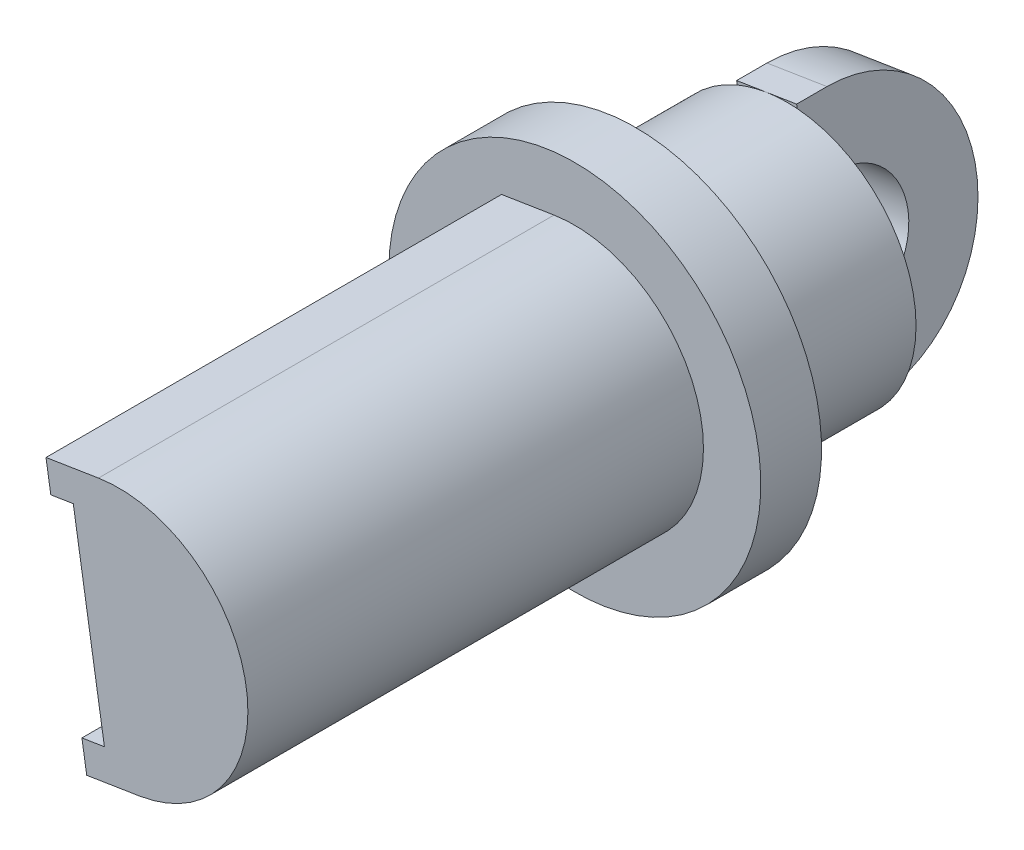
ISO-10303-21;
HEADER;
FILE_DESCRIPTION(('STEP AP214'),'2;1');
FILE_NAME('part.step','',(''),(''),'','','');
FILE_SCHEMA(('AUTOMOTIVE_DESIGN { 1 0 10303 214 1 1 1 1 }'));
ENDSEC;
DATA;
#1=APPLICATION_CONTEXT('core data for automotive mechanical design processes');
#2=APPLICATION_PROTOCOL_DEFINITION('international standard','automotive_design',2000,#1);
#3=PRODUCT_CONTEXT('',#1,'mechanical');
#4=PRODUCT('Part','Part','',(#3));
#5=PRODUCT_RELATED_PRODUCT_CATEGORY('part','',(#4));
#6=PRODUCT_DEFINITION_FORMATION('','',#4);
#7=PRODUCT_DEFINITION_CONTEXT('part definition',#1,'design');
#8=PRODUCT_DEFINITION('design','',#6,#7);
#9=PRODUCT_DEFINITION_SHAPE('','',#8);
#10=(LENGTH_UNIT() NAMED_UNIT(*) SI_UNIT(.MILLI.,.METRE.));
#11=(NAMED_UNIT(*) PLANE_ANGLE_UNIT() SI_UNIT($,.RADIAN.));
#12=(NAMED_UNIT(*) SI_UNIT($,.STERADIAN.) SOLID_ANGLE_UNIT());
#13=UNCERTAINTY_MEASURE_WITH_UNIT(LENGTH_MEASURE(1.E-05),#10,'distance_accuracy_value','');
#14=(GEOMETRIC_REPRESENTATION_CONTEXT(3) GLOBAL_UNCERTAINTY_ASSIGNED_CONTEXT((#13)) GLOBAL_UNIT_ASSIGNED_CONTEXT((#10,
#11,#12)) REPRESENTATION_CONTEXT('',''));
#15=CARTESIAN_POINT('',(0.,0.,0.));
#16=DIRECTION('',(0.,0.,1.));
#17=DIRECTION('',(1.,0.,0.));
#18=AXIS2_PLACEMENT_3D('',#15,#16,#17);
#19=CARTESIAN_POINT('',(-35.5668829363061,-57.3685454593075,0.));
#20=DIRECTION('',(0.,0.,1.));
#21=DIRECTION('',(1.,0.,0.));
#22=AXIS2_PLACEMENT_3D('',#19,#20,#21);
#23=PLANE('',#22);
#24=CARTESIAN_POINT('',(-37.2246621933937,-53.3294529950564,0.));
#25=DIRECTION('',(0.,0.,-1.));
#26=DIRECTION('',(1.,0.,0.));
#27=AXIS2_PLACEMENT_3D('',#24,#25,#26);
#28=CIRCLE('',#27,4.25);
#29=CARTESIAN_POINT('',(-36.5543673811667,-57.5262618857138,0.));
#30=VERTEX_POINT('',#29);
#31=CARTESIAN_POINT('',(-37.5606708795801,-57.5661496047757,0.));
#32=VERTEX_POINT('',#31);
#33=EDGE_CURVE('E211',#30,#32,#28,.T.);
#34=ORIENTED_EDGE('',*,*,#33,.T.);
#35=DIRECTION('',(-0.157716426406365,0.987484444860579,0.));
#36=VECTOR('',#35,1.);
#37=CARTESIAN_POINT('',(-37.5418518260273,-57.6839783121202,0.));
#38=LINE('',#37,#36);
#39=CARTESIAN_POINT('',(-37.5418518260273,-57.6839783121202,0.));
#40=VERTEX_POINT('',#39);
#41=EDGE_CURVE('E254',#40,#32,#38,.T.);
#42=ORIENTED_EDGE('',*,*,#41,.F.);
#43=DIRECTION('',(-0.987484444860579,-0.157716426406364,0.));
#44=VECTOR('',#43,1.);
#45=CARTESIAN_POINT('',(-35.5668829363061,-57.3685454593075,0.));
#46=LINE('',#45,#44);
#47=EDGE_CURVE('E249',#30,#40,#46,.T.);
#48=ORIENTED_EDGE('',*,*,#47,.F.);
#49=EDGE_LOOP('',(#34,#42,#48));
#50=FACE_BOUND('',#49,.T.);
#51=ADVANCED_FACE('F45',(#50),#23,.T.);
#52=CARTESIAN_POINT('',(-37.8949570056207,-49.1326441043989,0.));
#53=VERTEX_POINT('',#52);
#54=CARTESIAN_POINT('',(-36.8886535072073,-49.0927563853371,0.));
#55=VERTEX_POINT('',#54);
#56=EDGE_CURVE('E396',#53,#55,#28,.T.);
#57=ORIENTED_EDGE('',*,*,#56,.T.);
#58=DIRECTION('',(-0.157716426406365,0.987484444860579,0.));
#59=VECTOR('',#58,1.);
#60=CARTESIAN_POINT('',(-35.5668829363061,-57.3685454593075,0.));
#61=LINE('',#60,#59);
#62=CARTESIAN_POINT('',(-36.9074725607602,-48.9749276779926,0.));
#63=VERTEX_POINT('',#62);
#64=EDGE_CURVE('E234',#55,#63,#61,.T.);
#65=ORIENTED_EDGE('',*,*,#64,.T.);
#66=DIRECTION('',(-0.987484444860579,-0.157716426406364,0.));
#67=VECTOR('',#66,1.);
#68=CARTESIAN_POINT('',(-36.9074725607602,-48.9749276779926,0.));
#69=LINE('',#68,#67);
#70=EDGE_CURVE('E272',#63,#53,#69,.T.);
#71=ORIENTED_EDGE('',*,*,#70,.T.);
#72=EDGE_LOOP('',(#57,#65,#71));
#73=FACE_BOUND('',#72,.T.);
#74=ADVANCED_FACE('F341',(#73),#23,.T.);
#75=CARTESIAN_POINT('',(-35.5857019898589,-57.250716751963,0.));
#76=VERTEX_POINT('',#75);
#77=EDGE_CURVE('E206',#76,#30,#28,.T.);
#78=ORIENTED_EDGE('',*,*,#77,.T.);
#79=CARTESIAN_POINT('',(-35.5668829363061,-57.3685454593075,0.));
#80=VERTEX_POINT('',#79);
#81=EDGE_CURVE('E277',#80,#30,#46,.T.);
#82=ORIENTED_EDGE('',*,*,#81,.F.);
#83=EDGE_CURVE('E236',#80,#76,#61,.T.);
#84=ORIENTED_EDGE('',*,*,#83,.T.);
#85=EDGE_LOOP('',(#78,#82,#84));
#86=FACE_BOUND('',#85,.T.);
#87=ADVANCED_FACE('F348',(#86),#23,.T.);
#88=CARTESIAN_POINT('',(-35.5668829363061,-57.3685454593075,-1.));
#89=DIRECTION('',(0.157716426406364,-0.987484444860579,0.));
#90=DIRECTION('',(0.987484444860579,0.157716426406364,0.));
#91=AXIS2_PLACEMENT_3D('',#88,#89,#90);
#92=PLANE('',#91);
#93=DIRECTION('',(0.,0.,1.));
#94=VECTOR('',#93,1.);
#95=CARTESIAN_POINT('',(-37.5418518260273,-57.6839783121202,-1.));
#96=LINE('',#95,#94);
#97=CARTESIAN_POINT('',(-37.5418518260273,-57.6839783121202,-1.));
#98=VERTEX_POINT('',#97);
#99=EDGE_CURVE('E229',#98,#40,#96,.T.);
#100=ORIENTED_EDGE('',*,*,#99,.F.);
#101=DIRECTION('',(-0.987484444860579,-0.157716426406364,0.));
#102=VECTOR('',#101,1.);
#103=CARTESIAN_POINT('',(-35.5668829363061,-57.3685454593074,-1.));
#104=LINE('',#103,#102);
#105=CARTESIAN_POINT('',(-35.5668829363061,-57.3685454593074,-1.));
#106=VERTEX_POINT('',#105);
#107=EDGE_CURVE('E265',#106,#98,#104,.T.);
#108=ORIENTED_EDGE('',*,*,#107,.F.);
#109=DIRECTION('',(0.,0.,1.));
#110=VECTOR('',#109,1.);
#111=CARTESIAN_POINT('',(-35.5668829363061,-57.3685454593075,-1.));
#112=LINE('',#111,#110);
#113=EDGE_CURVE('E230',#106,#80,#112,.T.);
#114=ORIENTED_EDGE('',*,*,#113,.T.);
#115=ORIENTED_EDGE('',*,*,#81,.T.);
#116=ORIENTED_EDGE('',*,*,#47,.T.);
#117=EDGE_LOOP('',(#100,#108,#114,#115,#116));
#118=FACE_BOUND('',#117,.T.);
#119=ADVANCED_FACE('F47',(#118),#92,.T.);
#120=CARTESIAN_POINT('',(-36.2371777485331,-53.17173656865,-1.));
#121=DIRECTION('',(-0.987484444860579,-0.157716426406364,0.));
#122=DIRECTION('',(0.157716426406364,-0.987484444860579,0.));
#123=AXIS2_PLACEMENT_3D('',#120,#121,#122);
#124=CYLINDRICAL_SURFACE('',#123,4.24999999999999);
#125=CARTESIAN_POINT('',(-38.2121466382543,-53.4871694214627,-1.));
#126=DIRECTION('',(-0.987484444860579,-0.157716426406364,0.));
#127=DIRECTION('',(0.157716426406364,-0.987484444860579,0.));
#128=AXIS2_PLACEMENT_3D('',#125,#126,#127);
#129=CIRCLE('',#128,4.24999999999999);
#130=CARTESIAN_POINT('',(-38.8824414504814,-49.2903605308053,-1.));
#131=VERTEX_POINT('',#130);
#132=EDGE_CURVE('E235',#131,#98,#129,.T.);
#133=ORIENTED_EDGE('',*,*,#132,.F.);
#134=DIRECTION('',(-0.987484444860579,-0.157716426406364,0.));
#135=VECTOR('',#134,1.);
#136=CARTESIAN_POINT('',(-36.9074725607602,-48.9749276779926,-1.));
#137=LINE('',#136,#135);
#138=CARTESIAN_POINT('',(-36.9074725607602,-48.9749276779926,-1.));
#139=VERTEX_POINT('',#138);
#140=EDGE_CURVE('E269',#139,#131,#137,.T.);
#141=ORIENTED_EDGE('',*,*,#140,.F.);
#142=CARTESIAN_POINT('',(-36.2371777485331,-53.17173656865,-1.));
#143=DIRECTION('',(-0.987484444860579,-0.157716426406364,0.));
#144=DIRECTION('',(0.157716426406364,-0.987484444860579,0.));
#145=AXIS2_PLACEMENT_3D('',#142,#143,#144);
#146=CIRCLE('',#145,4.24999999999999);
#147=EDGE_CURVE('E245',#139,#106,#146,.T.);
#148=ORIENTED_EDGE('',*,*,#147,.T.);
#149=ORIENTED_EDGE('',*,*,#107,.T.);
#150=EDGE_LOOP('',(#133,#141,#148,#149));
#151=FACE_BOUND('',#150,.T.);
#152=ADVANCED_FACE('F363',(#151),#124,.T.);
#153=CARTESIAN_POINT('',(-36.9074725607602,-48.9749276779926,0.));
#154=DIRECTION('',(-0.157716426406364,0.987484444860579,0.));
#155=DIRECTION('',(-0.987484444860579,-0.157716426406364,0.));
#156=AXIS2_PLACEMENT_3D('',#153,#154,#155);
#157=PLANE('',#156);
#158=DIRECTION('',(0.,0.,-1.));
#159=VECTOR('',#158,1.);
#160=CARTESIAN_POINT('',(-38.8824414504814,-49.2903605308053,0.));
#161=LINE('',#160,#159);
#162=CARTESIAN_POINT('',(-38.8824414504814,-49.2903605308053,0.));
#163=VERTEX_POINT('',#162);
#164=EDGE_CURVE('E258',#163,#131,#161,.T.);
#165=ORIENTED_EDGE('',*,*,#164,.F.);
#166=EDGE_CURVE('E276',#53,#163,#69,.T.);
#167=ORIENTED_EDGE('',*,*,#166,.F.);
#168=ORIENTED_EDGE('',*,*,#70,.F.);
#169=DIRECTION('',(0.,0.,-1.));
#170=VECTOR('',#169,1.);
#171=CARTESIAN_POINT('',(-36.9074725607602,-48.9749276779926,0.));
#172=LINE('',#171,#170);
#173=EDGE_CURVE('E240',#63,#139,#172,.T.);
#174=ORIENTED_EDGE('',*,*,#173,.T.);
#175=ORIENTED_EDGE('',*,*,#140,.T.);
#176=EDGE_LOOP('',(#165,#167,#168,#174,#175));
#177=FACE_BOUND('',#176,.T.);
#178=ADVANCED_FACE('F354',(#177),#157,.T.);
#179=CARTESIAN_POINT('',(-38.8636223969285,-49.4081892381498,0.));
#180=VERTEX_POINT('',#179);
#181=EDGE_CURVE('E399',#180,#53,#28,.T.);
#182=ORIENTED_EDGE('',*,*,#181,.T.);
#183=ORIENTED_EDGE('',*,*,#166,.T.);
#184=EDGE_CURVE('E253',#180,#163,#38,.T.);
#185=ORIENTED_EDGE('',*,*,#184,.F.);
#186=EDGE_LOOP('',(#182,#183,#185));
#187=FACE_BOUND('',#186,.T.);
#188=ADVANCED_FACE('F343',(#187),#23,.T.);
#189=CARTESIAN_POINT('',(-36.2371777485331,-53.17173656865,-1.));
#190=DIRECTION('',(-0.987484444860579,-0.157716426406364,0.));
#191=DIRECTION('',(0.157716426406364,-0.987484444860579,0.));
#192=AXIS2_PLACEMENT_3D('',#189,#190,#191);
#193=PLANE('',#192);
#194=CARTESIAN_POINT('',(-36.5103506122571,-51.4613633384676,0.));
#195=VERTEX_POINT('',#194);
#196=EDGE_CURVE('E241',#195,#55,#61,.T.);
#197=ORIENTED_EDGE('',*,*,#196,.F.);
#198=CARTESIAN_POINT('',(-36.2371777485331,-53.17173656865,-1.));
#199=DIRECTION('',(0.987484444860579,0.157716426406364,0.));
#200=DIRECTION('',(-0.157716426406364,0.987484444860579,0.));
#201=AXIS2_PLACEMENT_3D('',#198,#199,#200);
#202=CIRCLE('',#201,1.99999999999993);
#203=CARTESIAN_POINT('',(-35.9640048848091,-54.8821097988324,0.));
#204=VERTEX_POINT('',#203);
#205=EDGE_CURVE('E218',#204,#195,#202,.T.);
#206=ORIENTED_EDGE('',*,*,#205,.F.);
#207=DIRECTION('',(-0.157716426406364,0.987484444860579,0.));
#208=VECTOR('',#207,1.);
#209=CARTESIAN_POINT('',(-36.2371777485331,-53.17173656865,0.));
#210=LINE('',#209,#208);
#211=EDGE_CURVE('E215',#76,#204,#210,.T.);
#212=ORIENTED_EDGE('',*,*,#211,.F.);
#213=ORIENTED_EDGE('',*,*,#83,.F.);
#214=ORIENTED_EDGE('',*,*,#113,.F.);
#215=ORIENTED_EDGE('',*,*,#147,.F.);
#216=ORIENTED_EDGE('',*,*,#173,.F.);
#217=ORIENTED_EDGE('',*,*,#64,.F.);
#218=EDGE_LOOP('',(#197,#206,#212,#213,#214,#215,#216,#217));
#219=FACE_BOUND('',#218,.T.);
#220=ADVANCED_FACE('F353',(#219),#193,.F.);
#221=CARTESIAN_POINT('',(-38.2121466382543,-53.4871694214627,-1.));
#222=DIRECTION('',(-0.987484444860579,-0.157716426406364,0.));
#223=DIRECTION('',(0.157716426406364,-0.987484444860579,0.));
#224=AXIS2_PLACEMENT_3D('',#221,#222,#223);
#225=PLANE('',#224);
#226=CARTESIAN_POINT('',(-38.2121466382543,-53.4871694214627,-1.));
#227=DIRECTION('',(-0.987484444860579,-0.157716426406364,0.));
#228=DIRECTION('',(0.157716426406364,-0.987484444860579,0.));
#229=AXIS2_PLACEMENT_3D('',#226,#227,#228);
#230=CIRCLE('',#229,1.99999999999993);
#231=CARTESIAN_POINT('',(-38.4853195019783,-51.7767961912803,0.));
#232=VERTEX_POINT('',#231);
#233=CARTESIAN_POINT('',(-37.9389737745303,-55.1975426516451,0.));
#234=VERTEX_POINT('',#233);
#235=EDGE_CURVE('E268',#232,#234,#230,.T.);
#236=ORIENTED_EDGE('',*,*,#235,.F.);
#237=EDGE_CURVE('E69',#232,#180,#38,.T.);
#238=ORIENTED_EDGE('',*,*,#237,.T.);
#239=ORIENTED_EDGE('',*,*,#184,.T.);
#240=ORIENTED_EDGE('',*,*,#164,.T.);
#241=ORIENTED_EDGE('',*,*,#132,.T.);
#242=ORIENTED_EDGE('',*,*,#99,.T.);
#243=ORIENTED_EDGE('',*,*,#41,.T.);
#244=DIRECTION('',(-0.157716426406364,0.987484444860579,0.));
#245=VECTOR('',#244,1.);
#246=CARTESIAN_POINT('',(-38.2121466382543,-53.4871694214627,0.));
#247=LINE('',#246,#245);
#248=EDGE_CURVE('E210',#32,#234,#247,.T.);
#249=ORIENTED_EDGE('',*,*,#248,.T.);
#250=EDGE_LOOP('',(#236,#238,#239,#240,#241,#242,#243,#249));
#251=FACE_BOUND('',#250,.T.);
#252=ADVANCED_FACE('F360',(#251),#225,.T.);
#253=CARTESIAN_POINT('',(-36.2371777485331,-53.17173656865,-1.));
#254=DIRECTION('',(0.987484444860579,0.157716426406364,0.));
#255=DIRECTION('',(-0.157716426406364,0.987484444860579,0.));
#256=AXIS2_PLACEMENT_3D('',#253,#254,#255);
#257=CYLINDRICAL_SURFACE('',#256,1.99999999999993);
#258=DIRECTION('',(0.987484444860579,0.157716426406364,0.));
#259=VECTOR('',#258,1.);
#260=CARTESIAN_POINT('',(-35.9640048848091,-54.8821097988324,0.));
#261=LINE('',#260,#259);
#262=EDGE_CURVE('E225',#234,#204,#261,.T.);
#263=ORIENTED_EDGE('',*,*,#262,.T.);
#264=ORIENTED_EDGE('',*,*,#205,.T.);
#265=DIRECTION('',(0.987484444860579,0.157716426406364,0.));
#266=VECTOR('',#265,1.);
#267=CARTESIAN_POINT('',(-36.5103506122571,-51.4613633384676,0.));
#268=LINE('',#267,#266);
#269=EDGE_CURVE('E222',#195,#232,#268,.F.);
#270=ORIENTED_EDGE('',*,*,#269,.T.);
#271=ORIENTED_EDGE('',*,*,#235,.T.);
#272=EDGE_LOOP('',(#263,#264,#270,#271));
#273=FACE_BOUND('',#272,.T.);
#274=ADVANCED_FACE('F412',(#273),#257,.F.);
#275=CARTESIAN_POINT('',(-37.2246621933937,-53.3294529950564,0.));
#276=DIRECTION('',(0.,0.,1.));
#277=DIRECTION('',(1.,0.,0.));
#278=AXIS2_PLACEMENT_3D('',#275,#276,#277);
#279=PLANE('',#278);
#280=EDGE_CURVE('E200',#55,#76,#28,.T.);
#281=ORIENTED_EDGE('',*,*,#280,.T.);
#282=ORIENTED_EDGE('',*,*,#211,.T.);
#283=ORIENTED_EDGE('',*,*,#262,.F.);
#284=ORIENTED_EDGE('',*,*,#248,.F.);
#285=EDGE_CURVE('E401',#32,#180,#28,.T.);
#286=ORIENTED_EDGE('',*,*,#285,.T.);
#287=ORIENTED_EDGE('',*,*,#237,.F.);
#288=ORIENTED_EDGE('',*,*,#269,.F.);
#289=ORIENTED_EDGE('',*,*,#196,.T.);
#290=EDGE_LOOP('',(#281,#282,#283,#284,#286,#287,#288,#289));
#291=FACE_BOUND('',#290,.T.);
#292=ADVANCED_FACE('F395',(#291),#279,.F.);
#293=CARTESIAN_POINT('',(-37.2246621933937,-53.3294529950564,7.));
#294=DIRECTION('',(0.,0.,-1.));
#295=DIRECTION('',(-1.,0.,0.));
#296=AXIS2_PLACEMENT_3D('',#293,#294,#295);
#297=CYLINDRICAL_SURFACE('',#296,4.25);
#298=CARTESIAN_POINT('',(-37.2246621933937,-53.3294529950564,5.));
#299=DIRECTION('',(0.,0.,-1.));
#300=DIRECTION('',(-1.,0.,0.));
#301=AXIS2_PLACEMENT_3D('',#298,#299,#300);
#302=CIRCLE('',#301,4.25);
#303=CARTESIAN_POINT('',(-41.4746621933937,-53.3294529950564,5.));
#304=VERTEX_POINT('',#303);
#305=EDGE_CURVE('E11',#304,#304,#302,.F.);
#306=ORIENTED_EDGE('',*,*,#305,.F.);
#307=EDGE_LOOP('',(#306));
#308=FACE_BOUND('',#307,.T.);
#309=ORIENTED_EDGE('',*,*,#77,.F.);
#310=ORIENTED_EDGE('',*,*,#280,.F.);
#311=ORIENTED_EDGE('',*,*,#56,.F.);
#312=ORIENTED_EDGE('',*,*,#181,.F.);
#313=ORIENTED_EDGE('',*,*,#285,.F.);
#314=ORIENTED_EDGE('',*,*,#33,.F.);
#315=EDGE_LOOP('',(#309,#310,#311,#312,#313,#314));
#316=FACE_BOUND('',#315,.T.);
#317=ADVANCED_FACE('F335',(#308,#316),#297,.T.);
#318=CARTESIAN_POINT('',(-37.2109521695139,-53.4152933582224,5.));
#319=DIRECTION('',(0.,0.,1.));
#320=DIRECTION('',(1.,0.,0.));
#321=AXIS2_PLACEMENT_3D('',#318,#319,#320);
#322=CYLINDRICAL_SURFACE('',#321,6.12499999999999);
#323=CARTESIAN_POINT('',(-37.2109521695139,-53.4152933582224,5.));
#324=DIRECTION('',(0.,0.,-1.));
#325=DIRECTION('',(-1.,0.,0.));
#326=AXIS2_PLACEMENT_3D('',#323,#324,#325);
#327=CIRCLE('',#326,6.12499999999999);
#328=CARTESIAN_POINT('',(-43.3359521695139,-53.4152933582224,5.));
#329=VERTEX_POINT('',#328);
#330=EDGE_CURVE('E179',#329,#329,#327,.T.);
#331=ORIENTED_EDGE('',*,*,#330,.F.);
#332=EDGE_LOOP('',(#331));
#333=FACE_BOUND('',#332,.T.);
#334=CARTESIAN_POINT('',(-37.2109521695139,-53.4152933582224,7.));
#335=DIRECTION('',(0.,0.,-1.));
#336=DIRECTION('',(-1.,0.,0.));
#337=AXIS2_PLACEMENT_3D('',#334,#335,#336);
#338=CIRCLE('',#337,6.12499999999999);
#339=CARTESIAN_POINT('',(-43.3359521695139,-53.4152933582224,7.));
#340=VERTEX_POINT('',#339);
#341=EDGE_CURVE('E596',#340,#340,#338,.T.);
#342=ORIENTED_EDGE('',*,*,#341,.T.);
#343=EDGE_LOOP('',(#342));
#344=FACE_BOUND('',#343,.T.);
#345=ADVANCED_FACE('F485',(#333,#344),#322,.T.);
#346=CARTESIAN_POINT('',(-37.2109521695139,-53.4152933582224,5.));
#347=DIRECTION('',(0.,0.,-1.));
#348=DIRECTION('',(-1.,0.,0.));
#349=AXIS2_PLACEMENT_3D('',#346,#347,#348);
#350=PLANE('',#349);
#351=ORIENTED_EDGE('',*,*,#305,.T.);
#352=EDGE_LOOP('',(#351));
#353=FACE_BOUND('',#352,.T.);
#354=ORIENTED_EDGE('',*,*,#330,.T.);
#355=EDGE_LOOP('',(#354));
#356=FACE_BOUND('',#355,.T.);
#357=ADVANCED_FACE('F535',(#353,#356),#350,.T.);
#358=CARTESIAN_POINT('',(-37.6995682524336,-56.6964938672596,7.));
#359=DIRECTION('',(0.987484444860579,0.157716426406365,0.));
#360=DIRECTION('',(-0.157716426406365,0.987484444860579,0.));
#361=AXIS2_PLACEMENT_3D('',#358,#359,#360);
#362=PLANE('',#361);
#363=DIRECTION('',(-0.157716426406365,0.987484444860579,0.));
#364=VECTOR('',#363,1.);
#365=CARTESIAN_POINT('',(-37.6995682524336,-56.6964938672596,22.));
#366=LINE('',#365,#364);
#367=CARTESIAN_POINT('',(-37.6995682524336,-56.6964938672596,22.));
#368=VERTEX_POINT('',#367);
#369=CARTESIAN_POINT('',(-38.724725024075,-50.2778449756658,22.));
#370=VERTEX_POINT('',#369);
#371=EDGE_CURVE('E61',#368,#370,#366,.T.);
#372=ORIENTED_EDGE('',*,*,#371,.T.);
#373=DIRECTION('',(0.,0.,1.));
#374=VECTOR('',#373,1.);
#375=CARTESIAN_POINT('',(-38.724725024075,-50.2778449756658,7.));
#376=LINE('',#375,#374);
#377=CARTESIAN_POINT('',(-38.724725024075,-50.2778449756658,7.));
#378=VERTEX_POINT('',#377);
#379=EDGE_CURVE('E614',#378,#370,#376,.T.);
#380=ORIENTED_EDGE('',*,*,#379,.F.);
#381=DIRECTION('',(-0.157716426406365,0.987484444860579,0.));
#382=VECTOR('',#381,1.);
#383=CARTESIAN_POINT('',(-37.6995682524336,-56.6964938672596,7.));
#384=LINE('',#383,#382);
#385=CARTESIAN_POINT('',(-37.6995682524336,-56.6964938672596,7.));
#386=VERTEX_POINT('',#385);
#387=EDGE_CURVE('E602',#386,#378,#384,.T.);
#388=ORIENTED_EDGE('',*,*,#387,.F.);
#389=DIRECTION('',(0.,0.,1.));
#390=VECTOR('',#389,1.);
#391=CARTESIAN_POINT('',(-37.6995682524336,-56.6964938672596,7.));
#392=LINE('',#391,#390);
#393=EDGE_CURVE('E303',#386,#368,#392,.T.);
#394=ORIENTED_EDGE('',*,*,#393,.T.);
#395=EDGE_LOOP('',(#372,#380,#388,#394));
#396=FACE_BOUND('',#395,.T.);
#397=ADVANCED_FACE('F516',(#396),#362,.F.);
#398=CARTESIAN_POINT('',(-38.6870526972942,-56.854210293666,7.));
#399=DIRECTION('',(0.157716426406365,-0.987484444860579,0.));
#400=DIRECTION('',(0.987484444860579,0.157716426406365,0.));
#401=AXIS2_PLACEMENT_3D('',#398,#399,#400);
#402=PLANE('',#401);
#403=DIRECTION('',(-0.987484444860579,-0.157716426406365,0.));
#404=VECTOR('',#403,1.);
#405=CARTESIAN_POINT('',(-36.712083807573,-56.5387774408533,22.));
#406=LINE('',#405,#404);
#407=CARTESIAN_POINT('',(-38.440181586079,-56.8147811870644,22.));
#408=VERTEX_POINT('',#407);
#409=EDGE_CURVE('E54',#368,#408,#406,.T.);
#410=ORIENTED_EDGE('',*,*,#409,.F.);
#411=ORIENTED_EDGE('',*,*,#393,.F.);
#412=DIRECTION('',(0.987484444860579,0.157716426406365,0.));
#413=VECTOR('',#412,1.);
#414=CARTESIAN_POINT('',(-38.6870526972942,-56.854210293666,7.));
#415=LINE('',#414,#413);
#416=CARTESIAN_POINT('',(-38.440181586079,-56.8147811870644,7.));
#417=VERTEX_POINT('',#416);
#418=EDGE_CURVE('E611',#417,#386,#415,.T.);
#419=ORIENTED_EDGE('',*,*,#418,.F.);
#420=DIRECTION('',(0.,0.,-1.));
#421=VECTOR('',#420,1.);
#422=CARTESIAN_POINT('',(-38.440181586079,-56.8147811870644,22.));
#423=LINE('',#422,#421);
#424=EDGE_CURVE('E296',#408,#417,#423,.T.);
#425=ORIENTED_EDGE('',*,*,#424,.F.);
#426=EDGE_LOOP('',(#410,#411,#419,#425));
#427=FACE_BOUND('',#426,.T.);
#428=ADVANCED_FACE('F509',(#427),#402,.F.);
#429=CARTESIAN_POINT('',(-38.724725024075,-50.2778449756658,7.));
#430=DIRECTION('',(-0.157716426406371,0.987484444860578,0.));
#431=DIRECTION('',(-0.987484444860578,-0.157716426406371,0.));
#432=AXIS2_PLACEMENT_3D('',#429,#430,#431);
#433=PLANE('',#432);
#434=DIRECTION('',(-0.987484444860578,-0.157716426406371,0.));
#435=VECTOR('',#434,1.);
#436=CARTESIAN_POINT('',(-38.724725024075,-50.2778449756658,7.));
#437=LINE('',#436,#435);
#438=CARTESIAN_POINT('',(-39.4653383577204,-50.3961322954706,7.));
#439=VERTEX_POINT('',#438);
#440=EDGE_CURVE('E606',#378,#439,#437,.T.);
#441=ORIENTED_EDGE('',*,*,#440,.F.);
#442=ORIENTED_EDGE('',*,*,#379,.T.);
#443=DIRECTION('',(-0.987484444860578,-0.157716426406371,0.));
#444=VECTOR('',#443,1.);
#445=CARTESIAN_POINT('',(-38.724725024075,-50.2778449756658,22.));
#446=LINE('',#445,#444);
#447=CARTESIAN_POINT('',(-39.4653383577204,-50.3961322954706,22.));
#448=VERTEX_POINT('',#447);
#449=EDGE_CURVE('E607',#370,#448,#446,.T.);
#450=ORIENTED_EDGE('',*,*,#449,.T.);
#451=DIRECTION('',(0.,0.,1.));
#452=VECTOR('',#451,1.);
#453=CARTESIAN_POINT('',(-39.4653383577204,-50.3961322954706,22.));
#454=LINE('',#453,#452);
#455=EDGE_CURVE('E300',#439,#448,#454,.T.);
#456=ORIENTED_EDGE('',*,*,#455,.F.);
#457=EDGE_LOOP('',(#441,#442,#450,#456));
#458=FACE_BOUND('',#457,.T.);
#459=ADVANCED_FACE('F515',(#458),#433,.F.);
#460=CARTESIAN_POINT('',(-37.2246621933937,-53.3294529950564,22.));
#461=DIRECTION('',(0.,0.,-1.));
#462=DIRECTION('',(-1.,0.,0.));
#463=AXIS2_PLACEMENT_3D('',#460,#461,#462);
#464=PLANE('',#463);
#465=ORIENTED_EDGE('',*,*,#371,.F.);
#466=ORIENTED_EDGE('',*,*,#409,.T.);
#467=DIRECTION('',(0.157716426406358,-0.98748444486058,0.));
#468=VECTOR('',#467,1.);
#469=CARTESIAN_POINT('',(-38.2824651596727,-57.8022656319249,22.));
#470=LINE('',#469,#468);
#471=CARTESIAN_POINT('',(-38.2824651596727,-57.8022656319249,22.));
#472=VERTEX_POINT('',#471);
#473=EDGE_CURVE('E312',#408,#472,#470,.T.);
#474=ORIENTED_EDGE('',*,*,#473,.T.);
#475=DIRECTION('',(0.98748444486058,0.157716426406358,0.));
#476=VECTOR('',#475,1.);
#477=CARTESIAN_POINT('',(-36.5543673811667,-57.5262618857138,22.));
#478=LINE('',#477,#476);
#479=CARTESIAN_POINT('',(-36.5543673811667,-57.5262618857139,22.));
#480=VERTEX_POINT('',#479);
#481=EDGE_CURVE('E311',#472,#480,#478,.T.);
#482=ORIENTED_EDGE('',*,*,#481,.T.);
#483=CARTESIAN_POINT('',(-37.2246621933937,-53.3294529950564,22.));
#484=DIRECTION('',(0.,0.,1.));
#485=DIRECTION('',(-1.,0.,0.));
#486=AXIS2_PLACEMENT_3D('',#483,#484,#485);
#487=CIRCLE('',#486,4.24999999999999);
#488=CARTESIAN_POINT('',(-37.8949570056207,-49.1326441043989,22.));
#489=VERTEX_POINT('',#488);
#490=EDGE_CURVE('E194',#480,#489,#487,.T.);
#491=ORIENTED_EDGE('',*,*,#490,.T.);
#492=DIRECTION('',(-0.98748444486058,-0.157716426406359,0.));
#493=VECTOR('',#492,1.);
#494=CARTESIAN_POINT('',(-39.6230547841267,-49.40864785061,22.));
#495=LINE('',#494,#493);
#496=CARTESIAN_POINT('',(-39.6230547841267,-49.40864785061,22.));
#497=VERTEX_POINT('',#496);
#498=EDGE_CURVE('E316',#489,#497,#495,.T.);
#499=ORIENTED_EDGE('',*,*,#498,.T.);
#500=EDGE_CURVE('E307',#497,#448,#470,.T.);
#501=ORIENTED_EDGE('',*,*,#500,.T.);
#502=ORIENTED_EDGE('',*,*,#449,.F.);
#503=EDGE_LOOP('',(#465,#466,#474,#482,#491,#499,#501,#502));
#504=FACE_BOUND('',#503,.T.);
#505=ADVANCED_FACE('F326',(#504),#464,.F.);
#506=CARTESIAN_POINT('',(-39.6230547841267,-49.40864785061,22.));
#507=DIRECTION('',(0.157716426406359,-0.98748444486058,0.));
#508=DIRECTION('',(0.98748444486058,0.157716426406359,0.));
#509=AXIS2_PLACEMENT_3D('',#506,#507,#508);
#510=PLANE('',#509);
#511=DIRECTION('',(-0.98748444486058,-0.157716426406359,0.));
#512=VECTOR('',#511,1.);
#513=CARTESIAN_POINT('',(-39.6230547841267,-49.40864785061,7.));
#514=LINE('',#513,#512);
#515=CARTESIAN_POINT('',(-37.8949570056207,-49.1326441043989,7.));
#516=VERTEX_POINT('',#515);
#517=CARTESIAN_POINT('',(-39.6230547841267,-49.40864785061,7.));
#518=VERTEX_POINT('',#517);
#519=EDGE_CURVE('E173',#516,#518,#514,.T.);
#520=ORIENTED_EDGE('',*,*,#519,.T.);
#521=DIRECTION('',(0.,0.,-1.));
#522=VECTOR('',#521,1.);
#523=CARTESIAN_POINT('',(-39.6230547841267,-49.40864785061,22.));
#524=LINE('',#523,#522);
#525=EDGE_CURVE('E202',#497,#518,#524,.T.);
#526=ORIENTED_EDGE('',*,*,#525,.F.);
#527=ORIENTED_EDGE('',*,*,#498,.F.);
#528=DIRECTION('',(0.,0.,-1.));
#529=VECTOR('',#528,1.);
#530=CARTESIAN_POINT('',(-37.8949570056207,-49.1326441043989,22.));
#531=LINE('',#530,#529);
#532=EDGE_CURVE('E196',#489,#516,#531,.T.);
#533=ORIENTED_EDGE('',*,*,#532,.T.);
#534=EDGE_LOOP('',(#520,#526,#527,#533));
#535=FACE_BOUND('',#534,.T.);
#536=ADVANCED_FACE('F339',(#535),#510,.F.);
#537=CARTESIAN_POINT('',(-38.2824651596727,-57.8022656319249,22.));
#538=DIRECTION('',(0.98748444486058,0.157716426406358,0.));
#539=DIRECTION('',(-0.157716426406358,0.98748444486058,0.));
#540=AXIS2_PLACEMENT_3D('',#537,#538,#539);
#541=PLANE('',#540);
#542=DIRECTION('',(0.157716426406358,-0.98748444486058,0.));
#543=VECTOR('',#542,1.);
#544=CARTESIAN_POINT('',(-38.2824651596727,-57.8022656319249,7.));
#545=LINE('',#544,#543);
#546=EDGE_CURVE('E283',#518,#439,#545,.T.);
#547=ORIENTED_EDGE('',*,*,#546,.T.);
#548=ORIENTED_EDGE('',*,*,#455,.T.);
#549=ORIENTED_EDGE('',*,*,#500,.F.);
#550=ORIENTED_EDGE('',*,*,#525,.T.);
#551=EDGE_LOOP('',(#547,#548,#549,#550));
#552=FACE_BOUND('',#551,.T.);
#553=ADVANCED_FACE('F330',(#552),#541,.F.);
#554=CARTESIAN_POINT('',(-37.2246621933937,-53.3294529950564,7.));
#555=DIRECTION('',(0.,0.,1.));
#556=DIRECTION('',(1.,0.,0.));
#557=AXIS2_PLACEMENT_3D('',#554,#555,#556);
#558=PLANE('',#557);
#559=CARTESIAN_POINT('',(-38.2824651596727,-57.8022656319249,7.));
#560=VERTEX_POINT('',#559);
#561=EDGE_CURVE('E191',#417,#560,#545,.T.);
#562=ORIENTED_EDGE('',*,*,#561,.F.);
#563=ORIENTED_EDGE('',*,*,#418,.T.);
#564=ORIENTED_EDGE('',*,*,#387,.T.);
#565=ORIENTED_EDGE('',*,*,#440,.T.);
#566=ORIENTED_EDGE('',*,*,#546,.F.);
#567=ORIENTED_EDGE('',*,*,#519,.F.);
#568=CARTESIAN_POINT('',(-37.2246621933937,-53.3294529950564,7.));
#569=DIRECTION('',(0.,0.,-1.));
#570=DIRECTION('',(-1.,0.,0.));
#571=AXIS2_PLACEMENT_3D('',#568,#569,#570);
#572=CIRCLE('',#571,4.25);
#573=CARTESIAN_POINT('',(-36.5543673811667,-57.5262618857139,7.));
#574=VERTEX_POINT('',#573);
#575=EDGE_CURVE('E166',#574,#516,#572,.F.);
#576=ORIENTED_EDGE('',*,*,#575,.F.);
#577=DIRECTION('',(0.98748444486058,0.157716426406358,0.));
#578=VECTOR('',#577,1.);
#579=CARTESIAN_POINT('',(-36.5543673811667,-57.5262618857138,7.));
#580=LINE('',#579,#578);
#581=EDGE_CURVE('E170',#560,#574,#580,.T.);
#582=ORIENTED_EDGE('',*,*,#581,.F.);
#583=EDGE_LOOP('',(#562,#563,#564,#565,#566,#567,#576,#582));
#584=FACE_BOUND('',#583,.T.);
#585=ORIENTED_EDGE('',*,*,#341,.F.);
#586=EDGE_LOOP('',(#585));
#587=FACE_BOUND('',#586,.T.);
#588=ADVANCED_FACE('F168',(#584,#587),#558,.T.);
#589=CARTESIAN_POINT('',(-36.5543673811667,-57.5262618857138,22.));
#590=DIRECTION('',(-0.157716426406358,0.98748444486058,0.));
#591=DIRECTION('',(-0.98748444486058,-0.157716426406358,0.));
#592=AXIS2_PLACEMENT_3D('',#589,#590,#591);
#593=PLANE('',#592);
#594=ORIENTED_EDGE('',*,*,#581,.T.);
#595=DIRECTION('',(0.,0.,-1.));
#596=VECTOR('',#595,1.);
#597=CARTESIAN_POINT('',(-36.5543673811667,-57.5262618857139,22.));
#598=LINE('',#597,#596);
#599=EDGE_CURVE('E186',#480,#574,#598,.T.);
#600=ORIENTED_EDGE('',*,*,#599,.F.);
#601=ORIENTED_EDGE('',*,*,#481,.F.);
#602=DIRECTION('',(0.,0.,-1.));
#603=VECTOR('',#602,1.);
#604=CARTESIAN_POINT('',(-38.2824651596727,-57.8022656319249,22.));
#605=LINE('',#604,#603);
#606=EDGE_CURVE('E189',#472,#560,#605,.T.);
#607=ORIENTED_EDGE('',*,*,#606,.T.);
#608=EDGE_LOOP('',(#594,#600,#601,#607));
#609=FACE_BOUND('',#608,.T.);
#610=ADVANCED_FACE('F184',(#609),#593,.F.);
#611=ORIENTED_EDGE('',*,*,#599,.T.);
#612=ORIENTED_EDGE('',*,*,#575,.T.);
#613=ORIENTED_EDGE('',*,*,#532,.F.);
#614=ORIENTED_EDGE('',*,*,#490,.F.);
#615=EDGE_LOOP('',(#611,#612,#613,#614));
#616=FACE_BOUND('',#615,.T.);
#617=ADVANCED_FACE('F193',(#616),#297,.T.);
#618=ORIENTED_EDGE('',*,*,#473,.F.);
#619=ORIENTED_EDGE('',*,*,#424,.T.);
#620=ORIENTED_EDGE('',*,*,#561,.T.);
#621=ORIENTED_EDGE('',*,*,#606,.F.);
#622=EDGE_LOOP('',(#618,#619,#620,#621));
#623=FACE_BOUND('',#622,.T.);
#624=ADVANCED_FACE('F327',(#623),#541,.F.);
#625=CLOSED_SHELL('',(#51,#74,#87,#119,#152,#178,#188,#220,#252,#274,#292,#317,#345,#357,#397,
#428,#459,#505,#536,#553,#588,#610,#617,#624));
#626=MANIFOLD_SOLID_BREP('B2',#625);
#627=ADVANCED_BREP_SHAPE_REPRESENTATION('',(#18,#626),#14);
#628=SHAPE_DEFINITION_REPRESENTATION(#9,#627);
ENDSEC;
END-ISO-10303-21;
